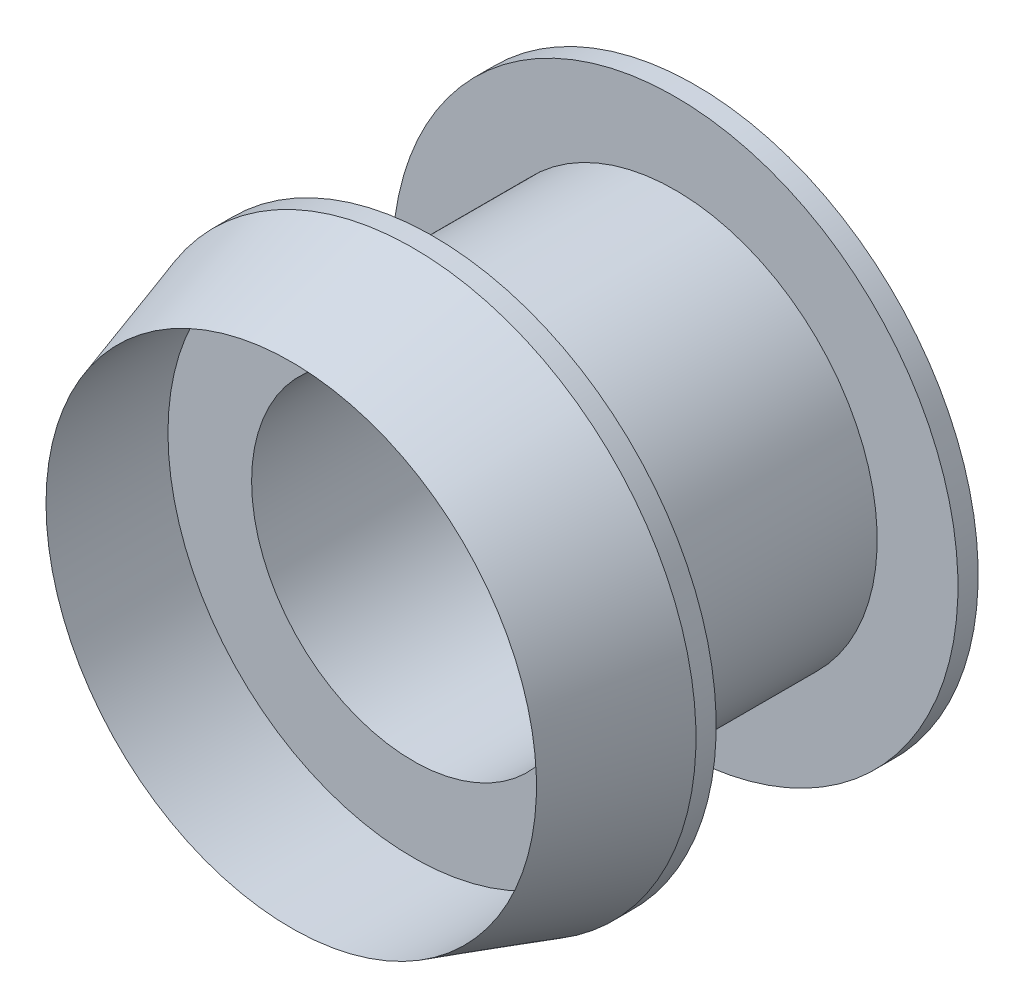
ISO-10303-21;
HEADER;
FILE_DESCRIPTION(('STEP AP214'),'2;1');
FILE_NAME('part.step','',(''),(''),'','','');
FILE_SCHEMA(('AUTOMOTIVE_DESIGN { 1 0 10303 214 1 1 1 1 }'));
ENDSEC;
DATA;
#1=APPLICATION_CONTEXT('core data for automotive mechanical design processes');
#2=APPLICATION_PROTOCOL_DEFINITION('international standard','automotive_design',2000,#1);
#3=PRODUCT_CONTEXT('',#1,'mechanical');
#4=PRODUCT('Part','Part','',(#3));
#5=PRODUCT_RELATED_PRODUCT_CATEGORY('part','',(#4));
#6=PRODUCT_DEFINITION_FORMATION('','',#4);
#7=PRODUCT_DEFINITION_CONTEXT('part definition',#1,'design');
#8=PRODUCT_DEFINITION('design','',#6,#7);
#9=PRODUCT_DEFINITION_SHAPE('','',#8);
#10=(LENGTH_UNIT() NAMED_UNIT(*) SI_UNIT(.MILLI.,.METRE.));
#11=(NAMED_UNIT(*) PLANE_ANGLE_UNIT() SI_UNIT($,.RADIAN.));
#12=(NAMED_UNIT(*) SI_UNIT($,.STERADIAN.) SOLID_ANGLE_UNIT());
#13=UNCERTAINTY_MEASURE_WITH_UNIT(LENGTH_MEASURE(1.E-05),#10,'distance_accuracy_value','');
#14=(GEOMETRIC_REPRESENTATION_CONTEXT(3) GLOBAL_UNCERTAINTY_ASSIGNED_CONTEXT((#13)) GLOBAL_UNIT_ASSIGNED_CONTEXT((#10,
#11,#12)) REPRESENTATION_CONTEXT('',''));
#15=CARTESIAN_POINT('',(0.,0.,0.));
#16=DIRECTION('',(0.,0.,1.));
#17=DIRECTION('',(1.,0.,0.));
#18=AXIS2_PLACEMENT_3D('',#15,#16,#17);
#19=CARTESIAN_POINT('',(0.,-12.7,0.));
#20=DIRECTION('',(0.,0.,-1.));
#21=DIRECTION('',(-1.,0.,0.));
#22=AXIS2_PLACEMENT_3D('',#19,#20,#21);
#23=CYLINDRICAL_SURFACE('',#22,50.8);
#24=CARTESIAN_POINT('',(0.,-12.7,87.8471000076337));
#25=DIRECTION('',(0.,0.,-1.));
#26=DIRECTION('',(-1.,0.,0.));
#27=AXIS2_PLACEMENT_3D('',#24,#25,#26);
#28=CIRCLE('',#27,50.8);
#29=CARTESIAN_POINT('',(-50.8,-12.7,87.8471000076337));
#30=VERTEX_POINT('',#29);
#31=EDGE_CURVE('E10',#30,#30,#28,.T.);
#32=ORIENTED_EDGE('',*,*,#31,.F.);
#33=EDGE_LOOP('',(#32));
#34=FACE_BOUND('',#33,.T.);
#35=CARTESIAN_POINT('',(0.,-12.7,-0.860872912222949));
#36=DIRECTION('',(0.,0.,-1.));
#37=DIRECTION('',(-1.,0.,0.));
#38=AXIS2_PLACEMENT_3D('',#35,#36,#37);
#39=CIRCLE('',#38,50.8);
#40=CARTESIAN_POINT('',(-50.8,-12.7,-0.860872912222949));
#41=VERTEX_POINT('',#40);
#42=EDGE_CURVE('E73',#41,#41,#39,.T.);
#43=ORIENTED_EDGE('',*,*,#42,.T.);
#44=EDGE_LOOP('',(#43));
#45=FACE_BOUND('',#44,.T.);
#46=ADVANCED_FACE('F39',(#34,#45),#23,.F.);
#47=CARTESIAN_POINT('',(0.,-63.5,87.8471000076337));
#48=DIRECTION('',(0.,0.,-1.));
#49=DIRECTION('',(-1.,0.,0.));
#50=AXIS2_PLACEMENT_3D('',#47,#48,#49);
#51=PLANE('',#50);
#52=CARTESIAN_POINT('',(0.,-12.7,87.8471000076337));
#53=DIRECTION('',(0.,0.,-1.));
#54=DIRECTION('',(-1.,0.,0.));
#55=AXIS2_PLACEMENT_3D('',#52,#53,#54);
#56=CIRCLE('',#55,77.0894406707744);
#57=CARTESIAN_POINT('',(-77.0894406707744,-12.7,87.8471000076337));
#58=VERTEX_POINT('',#57);
#59=EDGE_CURVE('E45',#58,#58,#56,.T.);
#60=ORIENTED_EDGE('',*,*,#59,.F.);
#61=EDGE_LOOP('',(#60));
#62=FACE_BOUND('',#61,.T.);
#63=ORIENTED_EDGE('',*,*,#31,.T.);
#64=EDGE_LOOP('',(#63));
#65=FACE_BOUND('',#64,.T.);
#66=ADVANCED_FACE('F122',(#62,#65),#51,.F.);
#67=CARTESIAN_POINT('',(0.,-12.7,0.));
#68=DIRECTION('',(0.,0.,-1.));
#69=DIRECTION('',(-1.,0.,0.));
#70=AXIS2_PLACEMENT_3D('',#67,#68,#69);
#71=CYLINDRICAL_SURFACE('',#70,77.0894406707744);
#72=CARTESIAN_POINT('',(0.,-12.7,126.185993667604));
#73=DIRECTION('',(0.,0.,-1.));
#74=DIRECTION('',(-1.,0.,0.));
#75=AXIS2_PLACEMENT_3D('',#72,#73,#74);
#76=CIRCLE('',#75,77.0894406707744);
#77=CARTESIAN_POINT('',(-77.0894406707744,-12.7,126.185993667604));
#78=VERTEX_POINT('',#77);
#79=EDGE_CURVE('E49',#78,#78,#76,.T.);
#80=ORIENTED_EDGE('',*,*,#79,.F.);
#81=EDGE_LOOP('',(#80));
#82=FACE_BOUND('',#81,.T.);
#83=ORIENTED_EDGE('',*,*,#59,.T.);
#84=EDGE_LOOP('',(#83));
#85=FACE_BOUND('',#84,.T.);
#86=ADVANCED_FACE('F117',(#82,#85),#71,.F.);
#87=CARTESIAN_POINT('',(0.,-12.7,126.185993667604));
#88=DIRECTION('',(0.,0.,-1.));
#89=DIRECTION('',(-1.,0.,0.));
#90=AXIS2_PLACEMENT_3D('',#87,#88,#89);
#91=CONICAL_SURFACE('',#90,77.0894406707744,0.298732622490709);
#92=CARTESIAN_POINT('',(0.,-12.7,87.8471000076337));
#93=DIRECTION('',(0.,0.,-1.));
#94=DIRECTION('',(-1.,0.,0.));
#95=AXIS2_PLACEMENT_3D('',#92,#93,#94);
#96=CIRCLE('',#95,88.895831723591);
#97=CARTESIAN_POINT('',(-88.895831723591,-12.7,87.8471000076337));
#98=VERTEX_POINT('',#97);
#99=EDGE_CURVE('E53',#98,#98,#96,.T.);
#100=ORIENTED_EDGE('',*,*,#99,.F.);
#101=EDGE_LOOP('',(#100));
#102=FACE_BOUND('',#101,.T.);
#103=ORIENTED_EDGE('',*,*,#79,.T.);
#104=EDGE_LOOP('',(#103));
#105=FACE_BOUND('',#104,.T.);
#106=ADVANCED_FACE('F111',(#102,#105),#91,.T.);
#107=CARTESIAN_POINT('',(0.,-12.7,0.));
#108=DIRECTION('',(0.,0.,-1.));
#109=DIRECTION('',(-1.,0.,0.));
#110=AXIS2_PLACEMENT_3D('',#107,#108,#109);
#111=CYLINDRICAL_SURFACE('',#110,88.895831723591);
#112=CARTESIAN_POINT('',(0.,-12.7,81.4971000076337));
#113=DIRECTION('',(0.,0.,-1.));
#114=DIRECTION('',(-1.,0.,0.));
#115=AXIS2_PLACEMENT_3D('',#112,#113,#114);
#116=CIRCLE('',#115,88.895831723591);
#117=CARTESIAN_POINT('',(-88.895831723591,-12.7,81.4971000076337));
#118=VERTEX_POINT('',#117);
#119=EDGE_CURVE('E58',#118,#118,#116,.T.);
#120=ORIENTED_EDGE('',*,*,#119,.F.);
#121=EDGE_LOOP('',(#120));
#122=FACE_BOUND('',#121,.T.);
#123=ORIENTED_EDGE('',*,*,#99,.T.);
#124=EDGE_LOOP('',(#123));
#125=FACE_BOUND('',#124,.T.);
#126=ADVANCED_FACE('F105',(#122,#125),#111,.T.);
#127=CARTESIAN_POINT('',(0.,-76.2,81.4971000076337));
#128=DIRECTION('',(0.,0.,1.));
#129=DIRECTION('',(1.,0.,0.));
#130=AXIS2_PLACEMENT_3D('',#127,#128,#129);
#131=PLANE('',#130);
#132=CARTESIAN_POINT('',(0.,-12.7,81.4971000076337));
#133=DIRECTION('',(0.,0.,-1.));
#134=DIRECTION('',(-1.,0.,0.));
#135=AXIS2_PLACEMENT_3D('',#132,#133,#134);
#136=CIRCLE('',#135,63.5);
#137=CARTESIAN_POINT('',(-63.5,-12.7,81.4971000076337));
#138=VERTEX_POINT('',#137);
#139=EDGE_CURVE('E61',#138,#138,#136,.T.);
#140=ORIENTED_EDGE('',*,*,#139,.F.);
#141=EDGE_LOOP('',(#140));
#142=FACE_BOUND('',#141,.T.);
#143=ORIENTED_EDGE('',*,*,#119,.T.);
#144=EDGE_LOOP('',(#143));
#145=FACE_BOUND('',#144,.T.);
#146=ADVANCED_FACE('F99',(#142,#145),#131,.F.);
#147=CARTESIAN_POINT('',(0.,-12.7,0.));
#148=DIRECTION('',(0.,0.,-1.));
#149=DIRECTION('',(-1.,0.,0.));
#150=AXIS2_PLACEMENT_3D('',#147,#148,#149);
#151=CYLINDRICAL_SURFACE('',#150,63.5);
#152=CARTESIAN_POINT('',(0.,-12.7,5.48912708777705));
#153=DIRECTION('',(0.,0.,-1.));
#154=DIRECTION('',(-1.,0.,0.));
#155=AXIS2_PLACEMENT_3D('',#152,#153,#154);
#156=CIRCLE('',#155,63.5);
#157=CARTESIAN_POINT('',(-63.5,-12.7,5.48912708777705));
#158=VERTEX_POINT('',#157);
#159=EDGE_CURVE('E64',#158,#158,#156,.T.);
#160=ORIENTED_EDGE('',*,*,#159,.F.);
#161=EDGE_LOOP('',(#160));
#162=FACE_BOUND('',#161,.T.);
#163=ORIENTED_EDGE('',*,*,#139,.T.);
#164=EDGE_LOOP('',(#163));
#165=FACE_BOUND('',#164,.T.);
#166=ADVANCED_FACE('F93',(#162,#165),#151,.T.);
#167=CARTESIAN_POINT('',(0.,-101.595831723591,5.48912708777705));
#168=DIRECTION('',(0.,0.,-1.));
#169=DIRECTION('',(-1.,0.,0.));
#170=AXIS2_PLACEMENT_3D('',#167,#168,#169);
#171=PLANE('',#170);
#172=CARTESIAN_POINT('',(0.,-12.7,5.48912708777705));
#173=DIRECTION('',(0.,0.,-1.));
#174=DIRECTION('',(-1.,0.,0.));
#175=AXIS2_PLACEMENT_3D('',#172,#173,#174);
#176=CIRCLE('',#175,88.895831723591);
#177=CARTESIAN_POINT('',(-88.895831723591,-12.7,5.48912708777705));
#178=VERTEX_POINT('',#177);
#179=EDGE_CURVE('E67',#178,#178,#176,.T.);
#180=ORIENTED_EDGE('',*,*,#179,.F.);
#181=EDGE_LOOP('',(#180));
#182=FACE_BOUND('',#181,.T.);
#183=ORIENTED_EDGE('',*,*,#159,.T.);
#184=EDGE_LOOP('',(#183));
#185=FACE_BOUND('',#184,.T.);
#186=ADVANCED_FACE('F87',(#182,#185),#171,.F.);
#187=CARTESIAN_POINT('',(0.,-12.7,0.));
#188=DIRECTION('',(0.,0.,-1.));
#189=DIRECTION('',(-1.,0.,0.));
#190=AXIS2_PLACEMENT_3D('',#187,#188,#189);
#191=CYLINDRICAL_SURFACE('',#190,88.895831723591);
#192=CARTESIAN_POINT('',(0.,-12.7,-0.860872912222949));
#193=DIRECTION('',(0.,0.,-1.));
#194=DIRECTION('',(-1.,0.,0.));
#195=AXIS2_PLACEMENT_3D('',#192,#193,#194);
#196=CIRCLE('',#195,88.895831723591);
#197=CARTESIAN_POINT('',(-88.895831723591,-12.7,-0.860872912222949));
#198=VERTEX_POINT('',#197);
#199=EDGE_CURVE('E70',#198,#198,#196,.T.);
#200=ORIENTED_EDGE('',*,*,#199,.F.);
#201=EDGE_LOOP('',(#200));
#202=FACE_BOUND('',#201,.T.);
#203=ORIENTED_EDGE('',*,*,#179,.T.);
#204=EDGE_LOOP('',(#203));
#205=FACE_BOUND('',#204,.T.);
#206=ADVANCED_FACE('F81',(#202,#205),#191,.T.);
#207=CARTESIAN_POINT('',(0.,-63.5,-0.860872912222949));
#208=DIRECTION('',(0.,0.,1.));
#209=DIRECTION('',(1.,0.,0.));
#210=AXIS2_PLACEMENT_3D('',#207,#208,#209);
#211=PLANE('',#210);
#212=ORIENTED_EDGE('',*,*,#42,.F.);
#213=EDGE_LOOP('',(#212));
#214=FACE_BOUND('',#213,.T.);
#215=ORIENTED_EDGE('',*,*,#199,.T.);
#216=EDGE_LOOP('',(#215));
#217=FACE_BOUND('',#216,.T.);
#218=ADVANCED_FACE('F78',(#214,#217),#211,.F.);
#219=CLOSED_SHELL('',(#46,#66,#86,#106,#126,#146,#166,#186,#206,#218));
#220=MANIFOLD_SOLID_BREP('B2',#219);
#221=ADVANCED_BREP_SHAPE_REPRESENTATION('',(#18,#220),#14);
#222=SHAPE_DEFINITION_REPRESENTATION(#9,#221);
ENDSEC;
END-ISO-10303-21;
